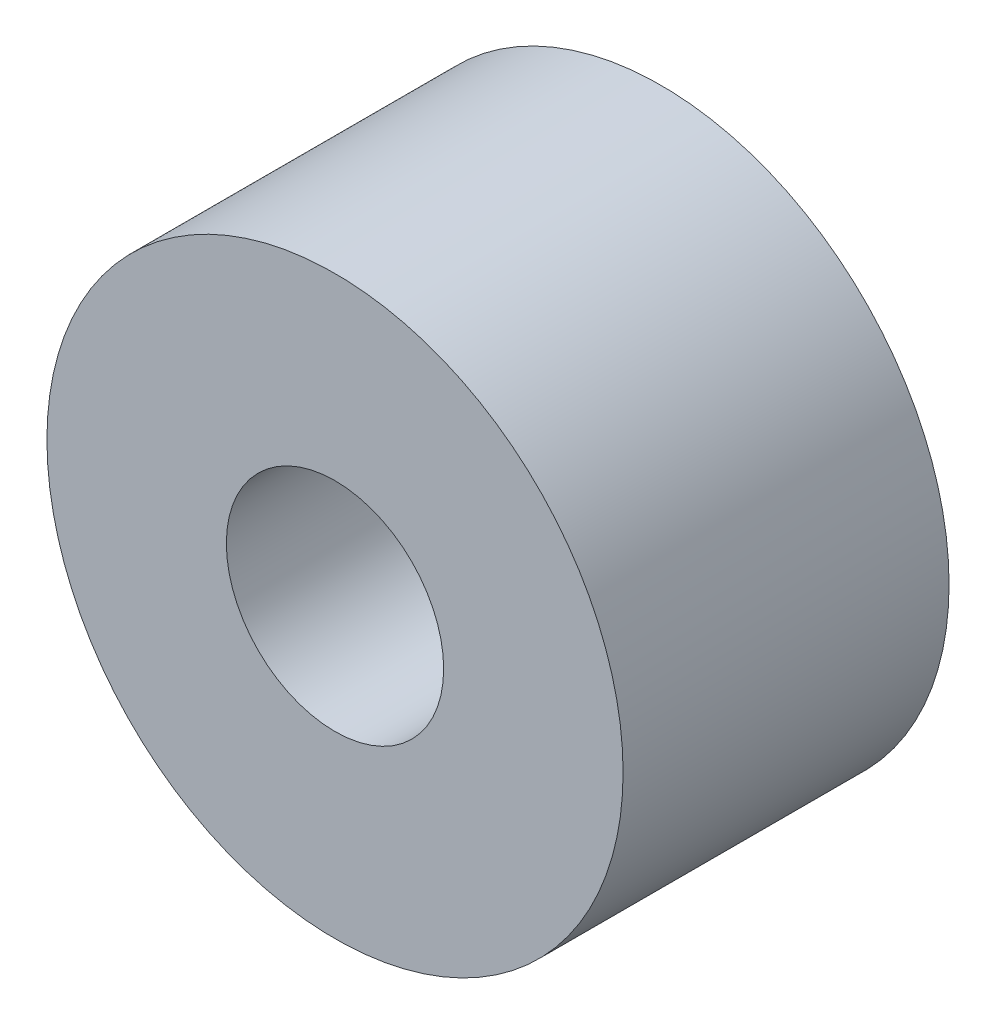
ISO-10303-21;
HEADER;
FILE_DESCRIPTION(('STEP AP214'),'2;1');
FILE_NAME('part.step','',(''),(''),'','','');
FILE_SCHEMA(('AUTOMOTIVE_DESIGN { 1 0 10303 214 1 1 1 1 }'));
ENDSEC;
DATA;
#1=APPLICATION_CONTEXT('core data for automotive mechanical design processes');
#2=APPLICATION_PROTOCOL_DEFINITION('international standard','automotive_design',2000,#1);
#3=PRODUCT_CONTEXT('',#1,'mechanical');
#4=PRODUCT('Part','Part','',(#3));
#5=PRODUCT_RELATED_PRODUCT_CATEGORY('part','',(#4));
#6=PRODUCT_DEFINITION_FORMATION('','',#4);
#7=PRODUCT_DEFINITION_CONTEXT('part definition',#1,'design');
#8=PRODUCT_DEFINITION('design','',#6,#7);
#9=PRODUCT_DEFINITION_SHAPE('','',#8);
#10=(LENGTH_UNIT() NAMED_UNIT(*) SI_UNIT(.MILLI.,.METRE.));
#11=(NAMED_UNIT(*) PLANE_ANGLE_UNIT() SI_UNIT($,.RADIAN.));
#12=(NAMED_UNIT(*) SI_UNIT($,.STERADIAN.) SOLID_ANGLE_UNIT());
#13=UNCERTAINTY_MEASURE_WITH_UNIT(LENGTH_MEASURE(1.E-05),#10,'distance_accuracy_value','');
#14=(GEOMETRIC_REPRESENTATION_CONTEXT(3) GLOBAL_UNCERTAINTY_ASSIGNED_CONTEXT((#13)) GLOBAL_UNIT_ASSIGNED_CONTEXT((#10,
#11,#12)) REPRESENTATION_CONTEXT('',''));
#15=CARTESIAN_POINT('',(0.,0.,0.));
#16=DIRECTION('',(0.,0.,1.));
#17=DIRECTION('',(1.,0.,0.));
#18=AXIS2_PLACEMENT_3D('',#15,#16,#17);
#19=CARTESIAN_POINT('',(0.,0.,2.38125));
#20=DIRECTION('',(0.,0.,1.));
#21=DIRECTION('',(1.,0.,0.));
#22=AXIS2_PLACEMENT_3D('',#19,#20,#21);
#23=PLANE('',#22);
#24=CARTESIAN_POINT('',(0.,0.,2.38125));
#25=DIRECTION('',(0.,0.,1.));
#26=DIRECTION('',(1.,0.,0.));
#27=AXIS2_PLACEMENT_3D('',#24,#25,#26);
#28=CIRCLE('',#27,4.20878);
#29=CARTESIAN_POINT('',(-4.20878,0.,2.38125));
#30=VERTEX_POINT('',#29);
#31=EDGE_CURVE('E10',#30,#30,#28,.T.);
#32=ORIENTED_EDGE('',*,*,#31,.T.);
#33=EDGE_LOOP('',(#32));
#34=FACE_BOUND('',#33,.T.);
#35=CARTESIAN_POINT('',(0.,0.,2.38125));
#36=DIRECTION('',(0.,0.,1.));
#37=DIRECTION('',(1.,0.,0.));
#38=AXIS2_PLACEMENT_3D('',#35,#36,#37);
#39=CIRCLE('',#38,1.5875);
#40=CARTESIAN_POINT('',(-1.5875,0.,2.38125));
#41=VERTEX_POINT('',#40);
#42=EDGE_CURVE('E42',#41,#41,#39,.T.);
#43=ORIENTED_EDGE('',*,*,#42,.F.);
#44=EDGE_LOOP('',(#43));
#45=FACE_BOUND('',#44,.T.);
#46=ADVANCED_FACE('F31',(#34,#45),#23,.T.);
#47=CARTESIAN_POINT('',(0.,0.,-2.38125));
#48=DIRECTION('',(0.,0.,1.));
#49=DIRECTION('',(1.,0.,0.));
#50=AXIS2_PLACEMENT_3D('',#47,#48,#49);
#51=PLANE('',#50);
#52=CARTESIAN_POINT('',(0.,0.,-2.38125));
#53=DIRECTION('',(0.,0.,1.));
#54=DIRECTION('',(1.,0.,0.));
#55=AXIS2_PLACEMENT_3D('',#52,#53,#54);
#56=CIRCLE('',#55,4.20878);
#57=CARTESIAN_POINT('',(-4.20878,0.,-2.38125));
#58=VERTEX_POINT('',#57);
#59=EDGE_CURVE('E35',#58,#58,#56,.T.);
#60=ORIENTED_EDGE('',*,*,#59,.F.);
#61=EDGE_LOOP('',(#60));
#62=FACE_BOUND('',#61,.T.);
#63=CARTESIAN_POINT('',(0.,0.,-2.38125));
#64=DIRECTION('',(0.,0.,1.));
#65=DIRECTION('',(1.,0.,0.));
#66=AXIS2_PLACEMENT_3D('',#63,#64,#65);
#67=CIRCLE('',#66,1.5875);
#68=CARTESIAN_POINT('',(-1.5875,0.,-2.38125));
#69=VERTEX_POINT('',#68);
#70=EDGE_CURVE('E44',#69,#69,#67,.T.);
#71=ORIENTED_EDGE('',*,*,#70,.T.);
#72=EDGE_LOOP('',(#71));
#73=FACE_BOUND('',#72,.T.);
#74=ADVANCED_FACE('F54',(#62,#73),#51,.F.);
#75=CARTESIAN_POINT('',(0.,0.,2.38125));
#76=DIRECTION('',(0.,0.,-1.));
#77=DIRECTION('',(-1.,0.,0.));
#78=AXIS2_PLACEMENT_3D('',#75,#76,#77);
#79=CYLINDRICAL_SURFACE('',#78,4.20878);
#80=CARTESIAN_POINT('',(-4.20878,0.,2.38125));
#81=CARTESIAN_POINT('',(-4.20878,0.,2.331640625));
#82=CARTESIAN_POINT('',(-4.20878,0.,2.28203125));
#83=CARTESIAN_POINT('',(-4.20878,0.,2.1828125));
#84=CARTESIAN_POINT('',(-4.20878,0.,2.133203125));
#85=CARTESIAN_POINT('',(-4.20878,0.,2.033984375));
#86=CARTESIAN_POINT('',(-4.20878,0.,1.984375));
#87=CARTESIAN_POINT('',(-4.20878,0.,1.88515625));
#88=CARTESIAN_POINT('',(-4.20878,0.,1.835546875));
#89=CARTESIAN_POINT('',(-4.20878,0.,1.736328125));
#90=CARTESIAN_POINT('',(-4.20878,0.,1.68671875));
#91=CARTESIAN_POINT('',(-4.20878,0.,1.5875));
#92=CARTESIAN_POINT('',(-4.20878,0.,1.537890625));
#93=CARTESIAN_POINT('',(-4.20878,0.,1.438671875));
#94=CARTESIAN_POINT('',(-4.20878,0.,1.3890625));
#95=CARTESIAN_POINT('',(-4.20878,0.,1.28984375));
#96=CARTESIAN_POINT('',(-4.20878,0.,1.240234375));
#97=CARTESIAN_POINT('',(-4.20878,0.,1.141015625));
#98=CARTESIAN_POINT('',(-4.20878,0.,1.09140625));
#99=CARTESIAN_POINT('',(-4.20878,0.,0.9921875));
#100=CARTESIAN_POINT('',(-4.20878,0.,0.942578125));
#101=CARTESIAN_POINT('',(-4.20878,0.,0.843359375));
#102=CARTESIAN_POINT('',(-4.20878,0.,0.79375));
#103=CARTESIAN_POINT('',(-4.20878,0.,0.69453125));
#104=CARTESIAN_POINT('',(-4.20878,0.,0.644921875));
#105=CARTESIAN_POINT('',(-4.20878,0.,0.545703125));
#106=CARTESIAN_POINT('',(-4.20878,0.,0.49609375));
#107=CARTESIAN_POINT('',(-4.20878,0.,0.396875));
#108=CARTESIAN_POINT('',(-4.20878,0.,0.347265625));
#109=CARTESIAN_POINT('',(-4.20878,0.,0.248046875));
#110=CARTESIAN_POINT('',(-4.20878,0.,0.1984375));
#111=CARTESIAN_POINT('',(-4.20878,0.,0.09921875));
#112=CARTESIAN_POINT('',(-4.20878,0.,0.049609375));
#113=CARTESIAN_POINT('',(-4.20878,0.,-0.049609375));
#114=CARTESIAN_POINT('',(-4.20878,0.,-0.09921875));
#115=CARTESIAN_POINT('',(-4.20878,0.,-0.1984375));
#116=CARTESIAN_POINT('',(-4.20878,0.,-0.248046875));
#117=CARTESIAN_POINT('',(-4.20878,0.,-0.347265625));
#118=CARTESIAN_POINT('',(-4.20878,0.,-0.396875));
#119=CARTESIAN_POINT('',(-4.20878,0.,-0.49609375));
#120=CARTESIAN_POINT('',(-4.20878,0.,-0.545703125));
#121=CARTESIAN_POINT('',(-4.20878,0.,-0.644921875));
#122=CARTESIAN_POINT('',(-4.20878,0.,-0.69453125));
#123=CARTESIAN_POINT('',(-4.20878,0.,-0.79375));
#124=CARTESIAN_POINT('',(-4.20878,0.,-0.843359375));
#125=CARTESIAN_POINT('',(-4.20878,0.,-0.942578125));
#126=CARTESIAN_POINT('',(-4.20878,0.,-0.9921875));
#127=CARTESIAN_POINT('',(-4.20878,0.,-1.09140625));
#128=CARTESIAN_POINT('',(-4.20878,0.,-1.141015625));
#129=CARTESIAN_POINT('',(-4.20878,0.,-1.240234375));
#130=CARTESIAN_POINT('',(-4.20878,0.,-1.28984375));
#131=CARTESIAN_POINT('',(-4.20878,0.,-1.3890625));
#132=CARTESIAN_POINT('',(-4.20878,0.,-1.438671875));
#133=CARTESIAN_POINT('',(-4.20878,0.,-1.537890625));
#134=CARTESIAN_POINT('',(-4.20878,0.,-1.5875));
#135=CARTESIAN_POINT('',(-4.20878,0.,-1.68671875));
#136=CARTESIAN_POINT('',(-4.20878,0.,-1.736328125));
#137=CARTESIAN_POINT('',(-4.20878,0.,-1.835546875));
#138=CARTESIAN_POINT('',(-4.20878,0.,-1.88515625));
#139=CARTESIAN_POINT('',(-4.20878,0.,-1.984375));
#140=CARTESIAN_POINT('',(-4.20878,0.,-2.033984375));
#141=CARTESIAN_POINT('',(-4.20878,0.,-2.133203125));
#142=CARTESIAN_POINT('',(-4.20878,0.,-2.1828125));
#143=CARTESIAN_POINT('',(-4.20878,0.,-2.28203125));
#144=CARTESIAN_POINT('',(-4.20878,0.,-2.331640625));
#145=CARTESIAN_POINT('',(-4.20878,0.,-2.38125));
#146=B_SPLINE_CURVE_WITH_KNOTS('',3,(#80,#81,#82,#83,#84,#85,#86,#87,#88,#89,#90,#91,#92,#93,
#94,#95,#96,#97,#98,#99,#100,#101,#102,#103,#104,#105,#106,#107,#108,#109,#110,#111,#112,#113,
#114,#115,#116,#117,#118,#119,#120,#121,#122,#123,#124,#125,#126,#127,#128,#129,#130,#131,#132,
#133,#134,#135,#136,#137,#138,#139,#140,#141,#142,#143,#144,#145),.UNSPECIFIED.,.F.,.F.,(4,2,2,
2,2,2,2,2,2,2,2,2,2,2,2,2,2,2,2,2,2,2,2,2,2,2,2,2,2,2,2,2,4),(0.,0.148828125,0.29765625,
0.446484375,0.5953125,0.744140625,0.89296875,1.041796875,1.190625,1.339453125,1.48828125,
1.637109375,1.7859375,1.934765625,2.08359375,2.232421875,2.38125,2.530078125,2.67890625,
2.827734375,2.9765625,3.125390625,3.27421875,3.423046875,3.571875,3.720703125,3.86953125,
4.018359375,4.1671875,4.316015625,4.46484375,4.613671875,4.7625),.UNSPECIFIED.);
#147=EDGE_CURVE('BSEAM33',#30,#58,#146,.T.);
#148=ORIENTED_EDGE('',*,*,#31,.F.);
#149=ORIENTED_EDGE('',*,*,#59,.T.);
#150=ORIENTED_EDGE('',*,*,#147,.T.);
#151=ORIENTED_EDGE('',*,*,#147,.F.);
#152=EDGE_LOOP('',(#148,#150,#149,#151));
#153=FACE_BOUND('',#152,.T.);
#154=ADVANCED_FACE('F33',(#153),#79,.T.);
#155=CARTESIAN_POINT('',(0.,0.,2.38125));
#156=DIRECTION('',(0.,0.,-1.));
#157=DIRECTION('',(-1.,0.,0.));
#158=AXIS2_PLACEMENT_3D('',#155,#156,#157);
#159=CYLINDRICAL_SURFACE('',#158,1.5875);
#160=CARTESIAN_POINT('',(-1.5875,0.,2.38125));
#161=CARTESIAN_POINT('',(-1.5875,0.,2.331640625));
#162=CARTESIAN_POINT('',(-1.5875,0.,2.28203125));
#163=CARTESIAN_POINT('',(-1.5875,0.,2.1828125));
#164=CARTESIAN_POINT('',(-1.5875,0.,2.133203125));
#165=CARTESIAN_POINT('',(-1.5875,0.,2.033984375));
#166=CARTESIAN_POINT('',(-1.5875,0.,1.984375));
#167=CARTESIAN_POINT('',(-1.5875,0.,1.88515625));
#168=CARTESIAN_POINT('',(-1.5875,0.,1.835546875));
#169=CARTESIAN_POINT('',(-1.5875,0.,1.736328125));
#170=CARTESIAN_POINT('',(-1.5875,0.,1.68671875));
#171=CARTESIAN_POINT('',(-1.5875,0.,1.5875));
#172=CARTESIAN_POINT('',(-1.5875,0.,1.537890625));
#173=CARTESIAN_POINT('',(-1.5875,0.,1.438671875));
#174=CARTESIAN_POINT('',(-1.5875,0.,1.3890625));
#175=CARTESIAN_POINT('',(-1.5875,0.,1.28984375));
#176=CARTESIAN_POINT('',(-1.5875,0.,1.240234375));
#177=CARTESIAN_POINT('',(-1.5875,0.,1.141015625));
#178=CARTESIAN_POINT('',(-1.5875,0.,1.09140625));
#179=CARTESIAN_POINT('',(-1.5875,0.,0.9921875));
#180=CARTESIAN_POINT('',(-1.5875,0.,0.942578125));
#181=CARTESIAN_POINT('',(-1.5875,0.,0.843359375));
#182=CARTESIAN_POINT('',(-1.5875,0.,0.79375));
#183=CARTESIAN_POINT('',(-1.5875,0.,0.69453125));
#184=CARTESIAN_POINT('',(-1.5875,0.,0.644921875));
#185=CARTESIAN_POINT('',(-1.5875,0.,0.545703125));
#186=CARTESIAN_POINT('',(-1.5875,0.,0.49609375));
#187=CARTESIAN_POINT('',(-1.5875,0.,0.396875));
#188=CARTESIAN_POINT('',(-1.5875,0.,0.347265625));
#189=CARTESIAN_POINT('',(-1.5875,0.,0.248046875));
#190=CARTESIAN_POINT('',(-1.5875,0.,0.1984375));
#191=CARTESIAN_POINT('',(-1.5875,0.,0.09921875));
#192=CARTESIAN_POINT('',(-1.5875,0.,0.049609375));
#193=CARTESIAN_POINT('',(-1.5875,0.,-0.049609375));
#194=CARTESIAN_POINT('',(-1.5875,0.,-0.09921875));
#195=CARTESIAN_POINT('',(-1.5875,0.,-0.1984375));
#196=CARTESIAN_POINT('',(-1.5875,0.,-0.248046875));
#197=CARTESIAN_POINT('',(-1.5875,0.,-0.347265625));
#198=CARTESIAN_POINT('',(-1.5875,0.,-0.396875));
#199=CARTESIAN_POINT('',(-1.5875,0.,-0.49609375));
#200=CARTESIAN_POINT('',(-1.5875,0.,-0.545703125));
#201=CARTESIAN_POINT('',(-1.5875,0.,-0.644921875));
#202=CARTESIAN_POINT('',(-1.5875,0.,-0.69453125));
#203=CARTESIAN_POINT('',(-1.5875,0.,-0.79375));
#204=CARTESIAN_POINT('',(-1.5875,0.,-0.843359375));
#205=CARTESIAN_POINT('',(-1.5875,0.,-0.942578125));
#206=CARTESIAN_POINT('',(-1.5875,0.,-0.9921875));
#207=CARTESIAN_POINT('',(-1.5875,0.,-1.09140625));
#208=CARTESIAN_POINT('',(-1.5875,0.,-1.141015625));
#209=CARTESIAN_POINT('',(-1.5875,0.,-1.240234375));
#210=CARTESIAN_POINT('',(-1.5875,0.,-1.28984375));
#211=CARTESIAN_POINT('',(-1.5875,0.,-1.3890625));
#212=CARTESIAN_POINT('',(-1.5875,0.,-1.438671875));
#213=CARTESIAN_POINT('',(-1.5875,0.,-1.537890625));
#214=CARTESIAN_POINT('',(-1.5875,0.,-1.5875));
#215=CARTESIAN_POINT('',(-1.5875,0.,-1.68671875));
#216=CARTESIAN_POINT('',(-1.5875,0.,-1.736328125));
#217=CARTESIAN_POINT('',(-1.5875,0.,-1.835546875));
#218=CARTESIAN_POINT('',(-1.5875,0.,-1.88515625));
#219=CARTESIAN_POINT('',(-1.5875,0.,-1.984375));
#220=CARTESIAN_POINT('',(-1.5875,0.,-2.033984375));
#221=CARTESIAN_POINT('',(-1.5875,0.,-2.133203125));
#222=CARTESIAN_POINT('',(-1.5875,0.,-2.1828125));
#223=CARTESIAN_POINT('',(-1.5875,0.,-2.28203125));
#224=CARTESIAN_POINT('',(-1.5875,0.,-2.331640625));
#225=CARTESIAN_POINT('',(-1.5875,0.,-2.38125));
#226=B_SPLINE_CURVE_WITH_KNOTS('',3,(#160,#161,#162,#163,#164,#165,#166,#167,#168,#169,#170,
#171,#172,#173,#174,#175,#176,#177,#178,#179,#180,#181,#182,#183,#184,#185,#186,#187,#188,#189,
#190,#191,#192,#193,#194,#195,#196,#197,#198,#199,#200,#201,#202,#203,#204,#205,#206,#207,#208,
#209,#210,#211,#212,#213,#214,#215,#216,#217,#218,#219,#220,#221,#222,#223,#224,#225),
.UNSPECIFIED.,.F.,.F.,(4,2,2,2,2,2,2,2,2,2,2,2,2,2,2,2,2,2,2,2,2,2,2,2,2,2,2,2,2,2,2,2,4),(0.,
0.148828125,0.29765625,0.446484375,0.5953125,0.744140625,0.89296875,1.041796875,1.190625,
1.339453125,1.48828125,1.637109375,1.7859375,1.934765625,2.08359375,2.232421875,2.38125,
2.530078125,2.67890625,2.827734375,2.9765625,3.125390625,3.27421875,3.423046875,3.571875,
3.720703125,3.86953125,4.018359375,4.1671875,4.316015625,4.46484375,4.613671875,4.7625),.UNSPECIFIED.);
#227=EDGE_CURVE('BSEAM50',#41,#69,#226,.T.);
#228=ORIENTED_EDGE('',*,*,#42,.T.);
#229=ORIENTED_EDGE('',*,*,#70,.F.);
#230=ORIENTED_EDGE('',*,*,#227,.T.);
#231=ORIENTED_EDGE('',*,*,#227,.F.);
#232=EDGE_LOOP('',(#228,#230,#229,#231));
#233=FACE_BOUND('',#232,.T.);
#234=ADVANCED_FACE('F50',(#233),#159,.F.);
#235=CLOSED_SHELL('',(#46,#74,#154,#234));
#236=MANIFOLD_SOLID_BREP('B2',#235);
#237=ADVANCED_BREP_SHAPE_REPRESENTATION('',(#18,#236),#14);
#238=SHAPE_DEFINITION_REPRESENTATION(#9,#237);
ENDSEC;
END-ISO-10303-21;
